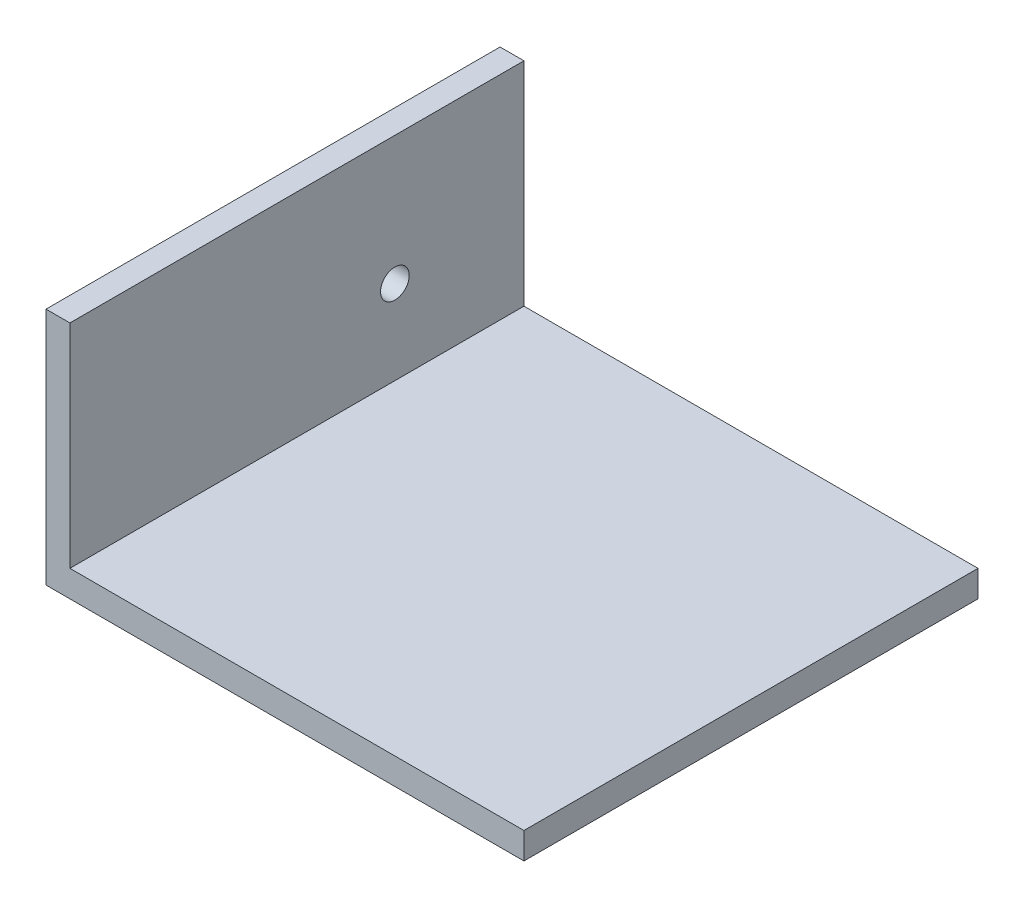
ISO-10303-21;
HEADER;
FILE_DESCRIPTION(('STEP AP214'),'2;1');
FILE_NAME('part.step','',(''),(''),'','','');
FILE_SCHEMA(('AUTOMOTIVE_DESIGN { 1 0 10303 214 1 1 1 1 }'));
ENDSEC;
DATA;
#1=APPLICATION_CONTEXT('core data for automotive mechanical design processes');
#2=APPLICATION_PROTOCOL_DEFINITION('international standard','automotive_design',2000,#1);
#3=PRODUCT_CONTEXT('',#1,'mechanical');
#4=PRODUCT('Part','Part','',(#3));
#5=PRODUCT_RELATED_PRODUCT_CATEGORY('part','',(#4));
#6=PRODUCT_DEFINITION_FORMATION('','',#4);
#7=PRODUCT_DEFINITION_CONTEXT('part definition',#1,'design');
#8=PRODUCT_DEFINITION('design','',#6,#7);
#9=PRODUCT_DEFINITION_SHAPE('','',#8);
#10=(LENGTH_UNIT() NAMED_UNIT(*) SI_UNIT(.MILLI.,.METRE.));
#11=(NAMED_UNIT(*) PLANE_ANGLE_UNIT() SI_UNIT($,.RADIAN.));
#12=(NAMED_UNIT(*) SI_UNIT($,.STERADIAN.) SOLID_ANGLE_UNIT());
#13=UNCERTAINTY_MEASURE_WITH_UNIT(LENGTH_MEASURE(1.E-05),#10,'distance_accuracy_value','');
#14=(GEOMETRIC_REPRESENTATION_CONTEXT(3) GLOBAL_UNCERTAINTY_ASSIGNED_CONTEXT((#13)) GLOBAL_UNIT_ASSIGNED_CONTEXT((#10,
#11,#12)) REPRESENTATION_CONTEXT('',''));
#15=CARTESIAN_POINT('',(0.,0.,0.));
#16=DIRECTION('',(0.,0.,1.));
#17=DIRECTION('',(1.,0.,0.));
#18=AXIS2_PLACEMENT_3D('',#15,#16,#17);
#19=CARTESIAN_POINT('',(-43.5503323362453,-14.3409425889731,95.));
#20=DIRECTION('',(1.,0.,0.));
#21=DIRECTION('',(0.,0.,-1.));
#22=AXIS2_PLACEMENT_3D('',#19,#20,#21);
#23=PLANE('',#22);
#24=CARTESIAN_POINT('',(-43.5503323362453,8.8,27.));
#25=DIRECTION('',(-1.,0.,0.));
#26=DIRECTION('',(0.,0.,1.));
#27=AXIS2_PLACEMENT_3D('',#24,#25,#26);
#28=CIRCLE('',#27,3.);
#29=CARTESIAN_POINT('',(-43.5503323362453,8.8,30.));
#30=VERTEX_POINT('',#29);
#31=EDGE_CURVE('E162',#30,#30,#28,.T.);
#32=ORIENTED_EDGE('',*,*,#31,.F.);
#33=EDGE_LOOP('',(#32));
#34=FACE_BOUND('',#33,.T.);
#35=DIRECTION('',(0.,-1.,0.));
#36=VECTOR('',#35,1.);
#37=CARTESIAN_POINT('',(-43.5503323362453,-14.3409425889731,0.));
#38=LINE('',#37,#36);
#39=CARTESIAN_POINT('',(-43.5503323362453,35.6590574110269,0.));
#40=VERTEX_POINT('',#39);
#41=CARTESIAN_POINT('',(-43.5503323362453,-14.3409425889731,0.));
#42=VERTEX_POINT('',#41);
#43=EDGE_CURVE('E119',#40,#42,#38,.T.);
#44=ORIENTED_EDGE('',*,*,#43,.T.);
#45=DIRECTION('',(0.,0.,-1.));
#46=VECTOR('',#45,1.);
#47=CARTESIAN_POINT('',(-43.5503323362453,-14.3409425889731,95.));
#48=LINE('',#47,#46);
#49=CARTESIAN_POINT('',(-43.5503323362453,-14.3409425889731,95.));
#50=VERTEX_POINT('',#49);
#51=EDGE_CURVE('E11',#50,#42,#48,.T.);
#52=ORIENTED_EDGE('',*,*,#51,.F.);
#53=DIRECTION('',(0.,-1.,0.));
#54=VECTOR('',#53,1.);
#55=CARTESIAN_POINT('',(-43.5503323362453,-14.3409425889731,95.));
#56=LINE('',#55,#54);
#57=CARTESIAN_POINT('',(-43.5503323362453,35.6590574110269,95.));
#58=VERTEX_POINT('',#57);
#59=EDGE_CURVE('E130',#58,#50,#56,.T.);
#60=ORIENTED_EDGE('',*,*,#59,.F.);
#61=DIRECTION('',(0.,0.,-1.));
#62=VECTOR('',#61,1.);
#63=CARTESIAN_POINT('',(-43.5503323362453,35.6590574110269,95.));
#64=LINE('',#63,#62);
#65=EDGE_CURVE('E115',#58,#40,#64,.T.);
#66=ORIENTED_EDGE('',*,*,#65,.T.);
#67=EDGE_LOOP('',(#44,#52,#60,#66));
#68=FACE_BOUND('',#67,.T.);
#69=ADVANCED_FACE('F35',(#34,#68),#23,.F.);
#70=CARTESIAN_POINT('',(56.4496676637547,-14.3409425889731,95.));
#71=DIRECTION('',(0.,1.,0.));
#72=DIRECTION('',(-1.,0.,0.));
#73=AXIS2_PLACEMENT_3D('',#70,#71,#72);
#74=PLANE('',#73);
#75=DIRECTION('',(1.,0.,0.));
#76=VECTOR('',#75,1.);
#77=CARTESIAN_POINT('',(56.4496676637547,-14.3409425889731,0.));
#78=LINE('',#77,#76);
#79=CARTESIAN_POINT('',(56.4496676637547,-14.3409425889731,0.));
#80=VERTEX_POINT('',#79);
#81=EDGE_CURVE('E122',#42,#80,#78,.T.);
#82=ORIENTED_EDGE('',*,*,#81,.T.);
#83=DIRECTION('',(0.,0.,-1.));
#84=VECTOR('',#83,1.);
#85=CARTESIAN_POINT('',(56.4496676637547,-14.3409425889731,95.));
#86=LINE('',#85,#84);
#87=CARTESIAN_POINT('',(56.4496676637547,-14.3409425889731,95.));
#88=VERTEX_POINT('',#87);
#89=EDGE_CURVE('E43',#88,#80,#86,.T.);
#90=ORIENTED_EDGE('',*,*,#89,.F.);
#91=DIRECTION('',(1.,0.,0.));
#92=VECTOR('',#91,1.);
#93=CARTESIAN_POINT('',(56.4496676637547,-14.3409425889731,95.));
#94=LINE('',#93,#92);
#95=EDGE_CURVE('E88',#50,#88,#94,.T.);
#96=ORIENTED_EDGE('',*,*,#95,.F.);
#97=ORIENTED_EDGE('',*,*,#51,.T.);
#98=EDGE_LOOP('',(#82,#90,#96,#97));
#99=FACE_BOUND('',#98,.T.);
#100=ADVANCED_FACE('F155',(#99),#74,.F.);
#101=CARTESIAN_POINT('',(56.4496676637547,-8.80683219278513,95.));
#102=DIRECTION('',(-1.,0.,0.));
#103=DIRECTION('',(0.,-1.,0.));
#104=AXIS2_PLACEMENT_3D('',#101,#102,#103);
#105=PLANE('',#104);
#106=DIRECTION('',(0.,1.,0.));
#107=VECTOR('',#106,1.);
#108=CARTESIAN_POINT('',(56.4496676637547,-8.80683219278513,0.));
#109=LINE('',#108,#107);
#110=CARTESIAN_POINT('',(56.4496676637547,-8.80683219278513,0.));
#111=VERTEX_POINT('',#110);
#112=EDGE_CURVE('E125',#80,#111,#109,.T.);
#113=ORIENTED_EDGE('',*,*,#112,.T.);
#114=DIRECTION('',(0.,0.,-1.));
#115=VECTOR('',#114,1.);
#116=CARTESIAN_POINT('',(56.4496676637547,-8.80683219278513,95.));
#117=LINE('',#116,#115);
#118=CARTESIAN_POINT('',(56.4496676637547,-8.80683219278513,95.));
#119=VERTEX_POINT('',#118);
#120=EDGE_CURVE('E110',#119,#111,#117,.T.);
#121=ORIENTED_EDGE('',*,*,#120,.F.);
#122=DIRECTION('',(0.,1.,0.));
#123=VECTOR('',#122,1.);
#124=CARTESIAN_POINT('',(56.4496676637547,-8.80683219278513,95.));
#125=LINE('',#124,#123);
#126=EDGE_CURVE('E101',#88,#119,#125,.T.);
#127=ORIENTED_EDGE('',*,*,#126,.F.);
#128=ORIENTED_EDGE('',*,*,#89,.T.);
#129=EDGE_LOOP('',(#113,#121,#127,#128));
#130=FACE_BOUND('',#129,.T.);
#131=ADVANCED_FACE('F136',(#130),#105,.F.);
#132=CARTESIAN_POINT('',(-38.5503323362453,-8.80683219278513,95.));
#133=DIRECTION('',(0.,-1.,0.));
#134=DIRECTION('',(0.,0.,-1.));
#135=AXIS2_PLACEMENT_3D('',#132,#133,#134);
#136=PLANE('',#135);
#137=DIRECTION('',(-1.,0.,0.));
#138=VECTOR('',#137,1.);
#139=CARTESIAN_POINT('',(-38.5503323362453,-8.80683219278513,0.));
#140=LINE('',#139,#138);
#141=CARTESIAN_POINT('',(-38.5503323362453,-8.80683219278513,0.));
#142=VERTEX_POINT('',#141);
#143=EDGE_CURVE('E109',#111,#142,#140,.T.);
#144=ORIENTED_EDGE('',*,*,#143,.T.);
#145=DIRECTION('',(0.,0.,-1.));
#146=VECTOR('',#145,1.);
#147=CARTESIAN_POINT('',(-38.5503323362453,-8.80683219278513,95.));
#148=LINE('',#147,#146);
#149=CARTESIAN_POINT('',(-38.5503323362453,-8.80683219278513,95.));
#150=VERTEX_POINT('',#149);
#151=EDGE_CURVE('E106',#150,#142,#148,.T.);
#152=ORIENTED_EDGE('',*,*,#151,.F.);
#153=DIRECTION('',(-1.,0.,0.));
#154=VECTOR('',#153,1.);
#155=CARTESIAN_POINT('',(-38.5503323362453,-8.80683219278513,95.));
#156=LINE('',#155,#154);
#157=EDGE_CURVE('E95',#119,#150,#156,.T.);
#158=ORIENTED_EDGE('',*,*,#157,.F.);
#159=ORIENTED_EDGE('',*,*,#120,.T.);
#160=EDGE_LOOP('',(#144,#152,#158,#159));
#161=FACE_BOUND('',#160,.T.);
#162=ADVANCED_FACE('F107',(#161),#136,.F.);
#163=CARTESIAN_POINT('',(-38.5503323362453,-8.80683219278513,95.));
#164=DIRECTION('',(-1.,0.,0.));
#165=DIRECTION('',(0.,0.,1.));
#166=AXIS2_PLACEMENT_3D('',#163,#164,#165);
#167=PLANE('',#166);
#168=CARTESIAN_POINT('',(-38.5503323362453,8.8,27.));
#169=DIRECTION('',(-1.,0.,0.));
#170=DIRECTION('',(0.,0.,1.));
#171=AXIS2_PLACEMENT_3D('',#168,#169,#170);
#172=CIRCLE('',#171,3.);
#173=CARTESIAN_POINT('',(-38.5503323362453,8.8,30.));
#174=VERTEX_POINT('',#173);
#175=EDGE_CURVE('E123',#174,#174,#172,.F.);
#176=ORIENTED_EDGE('',*,*,#175,.F.);
#177=EDGE_LOOP('',(#176));
#178=FACE_BOUND('',#177,.T.);
#179=DIRECTION('',(0.,1.,0.));
#180=VECTOR('',#179,1.);
#181=CARTESIAN_POINT('',(-38.5503323362453,-8.80683219278513,0.));
#182=LINE('',#181,#180);
#183=CARTESIAN_POINT('',(-38.5503323362453,35.6590574110269,0.));
#184=VERTEX_POINT('',#183);
#185=EDGE_CURVE('E74',#142,#184,#182,.T.);
#186=ORIENTED_EDGE('',*,*,#185,.T.);
#187=DIRECTION('',(0.,0.,-1.));
#188=VECTOR('',#187,1.);
#189=CARTESIAN_POINT('',(-38.5503323362453,35.6590574110269,95.));
#190=LINE('',#189,#188);
#191=CARTESIAN_POINT('',(-38.5503323362453,35.6590574110269,95.));
#192=VERTEX_POINT('',#191);
#193=EDGE_CURVE('E111',#192,#184,#190,.T.);
#194=ORIENTED_EDGE('',*,*,#193,.F.);
#195=DIRECTION('',(0.,1.,0.));
#196=VECTOR('',#195,1.);
#197=CARTESIAN_POINT('',(-38.5503323362453,-8.80683219278513,95.));
#198=LINE('',#197,#196);
#199=EDGE_CURVE('E99',#150,#192,#198,.T.);
#200=ORIENTED_EDGE('',*,*,#199,.F.);
#201=ORIENTED_EDGE('',*,*,#151,.T.);
#202=EDGE_LOOP('',(#186,#194,#200,#201));
#203=FACE_BOUND('',#202,.T.);
#204=ADVANCED_FACE('F113',(#178,#203),#167,.F.);
#205=CARTESIAN_POINT('',(-43.5503323362453,35.6590574110269,95.));
#206=DIRECTION('',(0.,-1.,0.));
#207=DIRECTION('',(0.,0.,-1.));
#208=AXIS2_PLACEMENT_3D('',#205,#206,#207);
#209=PLANE('',#208);
#210=DIRECTION('',(-1.,0.,0.));
#211=VECTOR('',#210,1.);
#212=CARTESIAN_POINT('',(-43.5503323362453,35.6590574110269,0.));
#213=LINE('',#212,#211);
#214=EDGE_CURVE('E80',#184,#40,#213,.T.);
#215=ORIENTED_EDGE('',*,*,#214,.T.);
#216=ORIENTED_EDGE('',*,*,#65,.F.);
#217=DIRECTION('',(-1.,0.,0.));
#218=VECTOR('',#217,1.);
#219=CARTESIAN_POINT('',(-43.5503323362453,35.6590574110269,95.));
#220=LINE('',#219,#218);
#221=EDGE_CURVE('E51',#192,#58,#220,.T.);
#222=ORIENTED_EDGE('',*,*,#221,.F.);
#223=ORIENTED_EDGE('',*,*,#193,.T.);
#224=EDGE_LOOP('',(#215,#216,#222,#223));
#225=FACE_BOUND('',#224,.T.);
#226=ADVANCED_FACE('F143',(#225),#209,.F.);
#227=CARTESIAN_POINT('',(0.,0.,95.));
#228=DIRECTION('',(0.,0.,-1.));
#229=DIRECTION('',(-1.,0.,0.));
#230=AXIS2_PLACEMENT_3D('',#227,#228,#229);
#231=PLANE('',#230);
#232=ORIENTED_EDGE('',*,*,#59,.T.);
#233=ORIENTED_EDGE('',*,*,#95,.T.);
#234=ORIENTED_EDGE('',*,*,#126,.T.);
#235=ORIENTED_EDGE('',*,*,#157,.T.);
#236=ORIENTED_EDGE('',*,*,#199,.T.);
#237=ORIENTED_EDGE('',*,*,#221,.T.);
#238=EDGE_LOOP('',(#232,#233,#234,#235,#236,#237));
#239=FACE_BOUND('',#238,.T.);
#240=ADVANCED_FACE('F97',(#239),#231,.F.);
#241=CARTESIAN_POINT('',(0.,0.,0.));
#242=DIRECTION('',(0.,0.,-1.));
#243=DIRECTION('',(-1.,0.,0.));
#244=AXIS2_PLACEMENT_3D('',#241,#242,#243);
#245=PLANE('',#244);
#246=ORIENTED_EDGE('',*,*,#43,.F.);
#247=ORIENTED_EDGE('',*,*,#214,.F.);
#248=ORIENTED_EDGE('',*,*,#185,.F.);
#249=ORIENTED_EDGE('',*,*,#143,.F.);
#250=ORIENTED_EDGE('',*,*,#112,.F.);
#251=ORIENTED_EDGE('',*,*,#81,.F.);
#252=EDGE_LOOP('',(#246,#247,#248,#249,#250,#251));
#253=FACE_BOUND('',#252,.T.);
#254=ADVANCED_FACE('F139',(#253),#245,.T.);
#255=CARTESIAN_POINT('',(56.4506676637547,8.8,27.));
#256=DIRECTION('',(-1.,0.,0.));
#257=DIRECTION('',(0.,0.,1.));
#258=AXIS2_PLACEMENT_3D('',#255,#256,#257);
#259=CYLINDRICAL_SURFACE('',#258,3.);
#260=ORIENTED_EDGE('',*,*,#31,.T.);
#261=EDGE_LOOP('',(#260));
#262=FACE_BOUND('',#261,.T.);
#263=ORIENTED_EDGE('',*,*,#175,.T.);
#264=EDGE_LOOP('',(#263));
#265=FACE_BOUND('',#264,.T.);
#266=ADVANCED_FACE('F171',(#262,#265),#259,.F.);
#267=CLOSED_SHELL('',(#69,#100,#131,#162,#204,#226,#240,#254,#266));
#268=MANIFOLD_SOLID_BREP('B2',#267);
#269=ADVANCED_BREP_SHAPE_REPRESENTATION('',(#18,#268),#14);
#270=SHAPE_DEFINITION_REPRESENTATION(#9,#269);
ENDSEC;
END-ISO-10303-21;
